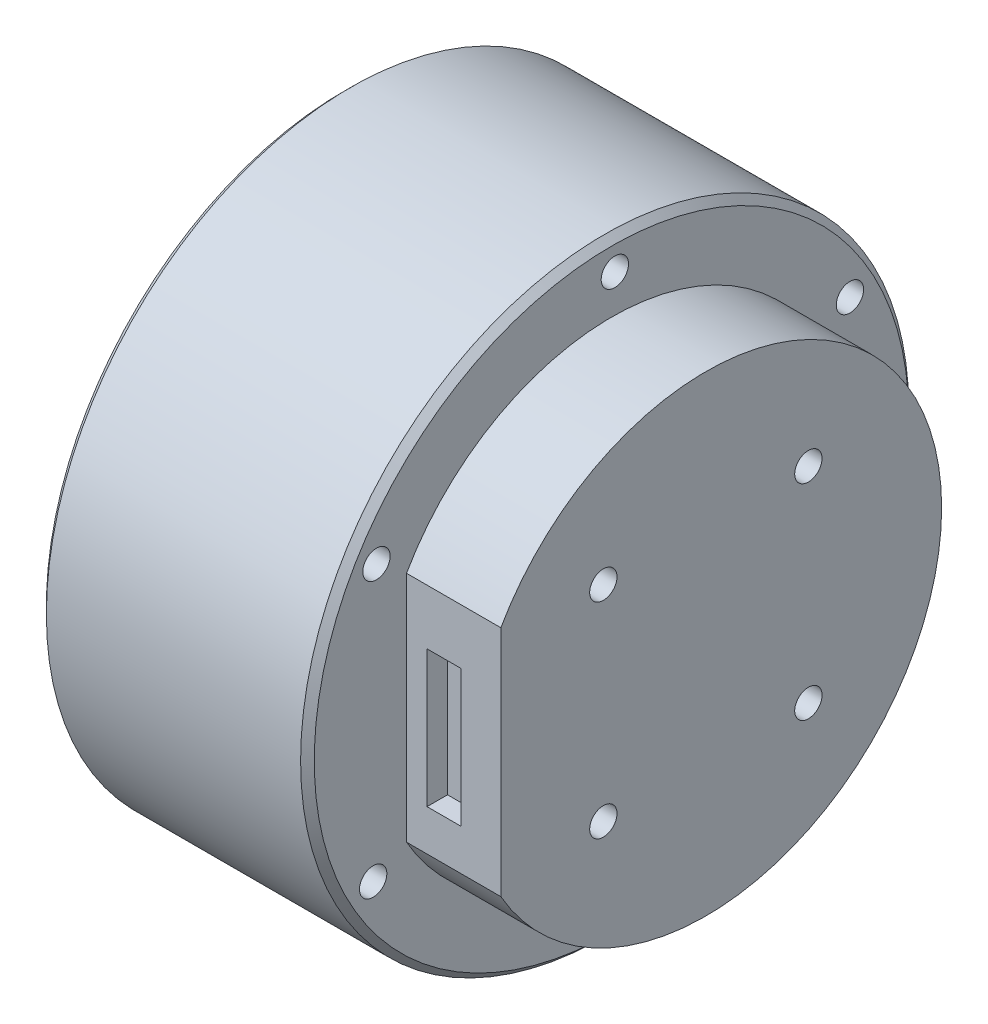
ISO-10303-21;
HEADER;
FILE_DESCRIPTION(('STEP AP214'),'2;1');
FILE_NAME('part.step','',(''),(''),'','','');
FILE_SCHEMA(('AUTOMOTIVE_DESIGN { 1 0 10303 214 1 1 1 1 }'));
ENDSEC;
DATA;
#1=APPLICATION_CONTEXT('core data for automotive mechanical design processes');
#2=APPLICATION_PROTOCOL_DEFINITION('international standard','automotive_design',2000,#1);
#3=PRODUCT_CONTEXT('',#1,'mechanical');
#4=PRODUCT('Part','Part','',(#3));
#5=PRODUCT_RELATED_PRODUCT_CATEGORY('part','',(#4));
#6=PRODUCT_DEFINITION_FORMATION('','',#4);
#7=PRODUCT_DEFINITION_CONTEXT('part definition',#1,'design');
#8=PRODUCT_DEFINITION('design','',#6,#7);
#9=PRODUCT_DEFINITION_SHAPE('','',#8);
#10=(LENGTH_UNIT() NAMED_UNIT(*) SI_UNIT(.MILLI.,.METRE.));
#11=(NAMED_UNIT(*) PLANE_ANGLE_UNIT() SI_UNIT($,.RADIAN.));
#12=(NAMED_UNIT(*) SI_UNIT($,.STERADIAN.) SOLID_ANGLE_UNIT());
#13=UNCERTAINTY_MEASURE_WITH_UNIT(LENGTH_MEASURE(1.E-05),#10,'distance_accuracy_value','');
#14=(GEOMETRIC_REPRESENTATION_CONTEXT(3) GLOBAL_UNCERTAINTY_ASSIGNED_CONTEXT((#13)) GLOBAL_UNIT_ASSIGNED_CONTEXT((#10,
#11,#12)) REPRESENTATION_CONTEXT('',''));
#15=CARTESIAN_POINT('',(0.,0.,0.));
#16=DIRECTION('',(0.,0.,1.));
#17=DIRECTION('',(1.,0.,0.));
#18=AXIS2_PLACEMENT_3D('',#15,#16,#17);
#19=CARTESIAN_POINT('',(39.2,0.,0.));
#20=DIRECTION('',(-1.,0.,0.));
#21=DIRECTION('',(0.,0.,1.));
#22=AXIS2_PLACEMENT_3D('',#19,#20,#21);
#23=CYLINDRICAL_SURFACE('',#22,44.5);
#24=CARTESIAN_POINT('',(38.2,0.,0.));
#25=DIRECTION('',(1.,0.,0.));
#26=DIRECTION('',(0.,0.,-1.));
#27=AXIS2_PLACEMENT_3D('',#24,#25,#26);
#28=CIRCLE('',#27,44.5);
#29=CARTESIAN_POINT('',(38.2,0.,-44.5));
#30=VERTEX_POINT('',#29);
#31=EDGE_CURVE('E45',#30,#30,#28,.F.);
#32=ORIENTED_EDGE('',*,*,#31,.T.);
#33=EDGE_LOOP('',(#32));
#34=FACE_BOUND('',#33,.T.);
#35=CARTESIAN_POINT('',(1.00000000000001,0.,0.));
#36=DIRECTION('',(1.,0.,0.));
#37=DIRECTION('',(0.,0.,-1.));
#38=AXIS2_PLACEMENT_3D('',#35,#36,#37);
#39=CIRCLE('',#38,44.5);
#40=CARTESIAN_POINT('',(1.00000000000001,0.,-44.5));
#41=VERTEX_POINT('',#40);
#42=EDGE_CURVE('E257',#41,#41,#39,.T.);
#43=ORIENTED_EDGE('',*,*,#42,.T.);
#44=EDGE_LOOP('',(#43));
#45=FACE_BOUND('',#44,.T.);
#46=ADVANCED_FACE('F36',(#34,#45),#23,.T.);
#47=CARTESIAN_POINT('',(39.2,0.,0.));
#48=DIRECTION('',(1.,0.,0.));
#49=DIRECTION('',(0.,0.,-1.));
#50=AXIS2_PLACEMENT_3D('',#47,#48,#49);
#51=PLANE('',#50);
#52=CARTESIAN_POINT('',(39.2,0.,0.));
#53=DIRECTION('',(1.,0.,0.));
#54=DIRECTION('',(0.,0.,-1.));
#55=AXIS2_PLACEMENT_3D('',#52,#53,#54);
#56=CIRCLE('',#55,43.5);
#57=CARTESIAN_POINT('',(39.2,0.,-43.5));
#58=VERTEX_POINT('',#57);
#59=EDGE_CURVE('E254',#58,#58,#56,.T.);
#60=ORIENTED_EDGE('',*,*,#59,.T.);
#61=EDGE_LOOP('',(#60));
#62=FACE_BOUND('',#61,.T.);
#63=CARTESIAN_POINT('',(39.2,39.997067774121,-0.484323726830935));
#64=DIRECTION('',(1.,0.,0.));
#65=DIRECTION('',(0.,0.,-1.));
#66=AXIS2_PLACEMENT_3D('',#63,#64,#65);
#67=CIRCLE('',#66,2.);
#68=CARTESIAN_POINT('',(39.2,39.997067774121,-2.48432372683093));
#69=VERTEX_POINT('',#68);
#70=EDGE_CURVE('E209',#69,#69,#67,.T.);
#71=ORIENTED_EDGE('',*,*,#70,.F.);
#72=EDGE_LOOP('',(#71));
#73=FACE_BOUND('',#72,.T.);
#74=CARTESIAN_POINT('',(39.2,20.4179705381501,34.3963149058604));
#75=DIRECTION('',(1.,0.,0.));
#76=DIRECTION('',(0.,0.,-1.));
#77=AXIS2_PLACEMENT_3D('',#74,#75,#76);
#78=CIRCLE('',#77,2.00000000000173);
#79=CARTESIAN_POINT('',(39.2,20.4179705381501,32.3963149058587));
#80=VERTEX_POINT('',#79);
#81=EDGE_CURVE('E202',#80,#80,#78,.T.);
#82=ORIENTED_EDGE('',*,*,#81,.F.);
#83=EDGE_LOOP('',(#82));
#84=FACE_BOUND('',#83,.T.);
#85=CARTESIAN_POINT('',(39.2,-19.5790972359709,34.8806386326897));
#86=DIRECTION('',(1.,0.,0.));
#87=DIRECTION('',(0.,0.,-1.));
#88=AXIS2_PLACEMENT_3D('',#85,#86,#87);
#89=CIRCLE('',#88,2.00000000000322);
#90=CARTESIAN_POINT('',(39.2,-19.5790972359709,32.8806386326864));
#91=VERTEX_POINT('',#90);
#92=EDGE_CURVE('E216',#91,#91,#89,.T.);
#93=ORIENTED_EDGE('',*,*,#92,.F.);
#94=EDGE_LOOP('',(#93));
#95=FACE_BOUND('',#94,.T.);
#96=CARTESIAN_POINT('',(39.2,-39.9970677741211,0.484323726827559));
#97=DIRECTION('',(1.,0.,0.));
#98=DIRECTION('',(0.,0.,-1.));
#99=AXIS2_PLACEMENT_3D('',#96,#97,#98);
#100=CIRCLE('',#99,2.00000000000348);
#101=CARTESIAN_POINT('',(39.2,-39.9970677741211,-1.51567627317592));
#102=VERTEX_POINT('',#101);
#103=EDGE_CURVE('E233',#102,#102,#100,.T.);
#104=ORIENTED_EDGE('',*,*,#103,.F.);
#105=EDGE_LOOP('',(#104));
#106=FACE_BOUND('',#105,.T.);
#107=CARTESIAN_POINT('',(39.2,-20.4179705381502,-34.3963149058638));
#108=DIRECTION('',(1.,0.,0.));
#109=DIRECTION('',(0.,0.,-1.));
#110=AXIS2_PLACEMENT_3D('',#107,#108,#109);
#111=CIRCLE('',#110,2.00000000000214);
#112=CARTESIAN_POINT('',(39.2,-20.4179705381502,-36.3963149058659));
#113=VERTEX_POINT('',#112);
#114=EDGE_CURVE('E227',#113,#113,#111,.T.);
#115=ORIENTED_EDGE('',*,*,#114,.F.);
#116=EDGE_LOOP('',(#115));
#117=FACE_BOUND('',#116,.T.);
#118=CARTESIAN_POINT('',(39.2,19.5790972359708,-34.880638632693));
#119=DIRECTION('',(1.,0.,0.));
#120=DIRECTION('',(0.,0.,-1.));
#121=AXIS2_PLACEMENT_3D('',#118,#119,#120);
#122=CIRCLE('',#121,2.00000000000045);
#123=CARTESIAN_POINT('',(39.2,19.5790972359708,-36.8806386326935));
#124=VERTEX_POINT('',#123);
#125=EDGE_CURVE('E221',#124,#124,#122,.T.);
#126=ORIENTED_EDGE('',*,*,#125,.F.);
#127=EDGE_LOOP('',(#126));
#128=FACE_BOUND('',#127,.T.);
#129=CARTESIAN_POINT('',(39.2,0.,0.));
#130=DIRECTION('',(1.,0.,0.));
#131=DIRECTION('',(0.,0.,-1.));
#132=AXIS2_PLACEMENT_3D('',#129,#130,#131);
#133=CIRCLE('',#132,34.5);
#134=CARTESIAN_POINT('',(39.2,-17.0367250374008,30.));
#135=VERTEX_POINT('',#134);
#136=CARTESIAN_POINT('',(39.2,17.0367250374008,30.));
#137=VERTEX_POINT('',#136);
#138=EDGE_CURVE('E208',#135,#137,#133,.T.);
#139=ORIENTED_EDGE('',*,*,#138,.F.);
#140=DIRECTION('',(0.,-1.,0.));
#141=VECTOR('',#140,1.);
#142=CARTESIAN_POINT('',(39.2,17.0367250374008,30.));
#143=LINE('',#142,#141);
#144=EDGE_CURVE('E59',#137,#135,#143,.T.);
#145=ORIENTED_EDGE('',*,*,#144,.F.);
#146=EDGE_LOOP('',(#139,#145));
#147=FACE_BOUND('',#146,.T.);
#148=ADVANCED_FACE('F270',(#62,#73,#84,#95,#106,#117,#128,#147),#51,.T.);
#149=CARTESIAN_POINT('',(0.,0.,0.));
#150=DIRECTION('',(1.,0.,0.));
#151=DIRECTION('',(0.,0.,-1.));
#152=AXIS2_PLACEMENT_3D('',#149,#150,#151);
#153=PLANE('',#152);
#154=CARTESIAN_POINT('',(0.,0.,0.));
#155=DIRECTION('',(-1.,0.,0.));
#156=DIRECTION('',(0.,0.,1.));
#157=AXIS2_PLACEMENT_3D('',#154,#155,#156);
#158=CIRCLE('',#157,8.75);
#159=CARTESIAN_POINT('',(0.,0.,8.75));
#160=VERTEX_POINT('',#159);
#161=EDGE_CURVE('E116',#160,#160,#158,.T.);
#162=ORIENTED_EDGE('',*,*,#161,.F.);
#163=EDGE_LOOP('',(#162));
#164=FACE_BOUND('',#163,.T.);
#165=CARTESIAN_POINT('',(0.,22.,0.));
#166=DIRECTION('',(-1.,0.,0.));
#167=DIRECTION('',(0.,0.,1.));
#168=AXIS2_PLACEMENT_3D('',#165,#166,#167);
#169=CIRCLE('',#168,2.5);
#170=CARTESIAN_POINT('',(0.,22.,2.5));
#171=VERTEX_POINT('',#170);
#172=EDGE_CURVE('E137',#171,#171,#169,.T.);
#173=ORIENTED_EDGE('',*,*,#172,.F.);
#174=EDGE_LOOP('',(#173));
#175=FACE_BOUND('',#174,.T.);
#176=CARTESIAN_POINT('',(0.,-12.3743686707639,12.3743686707665));
#177=DIRECTION('',(-1.,0.,0.));
#178=DIRECTION('',(0.,0.,1.));
#179=AXIS2_PLACEMENT_3D('',#176,#177,#178);
#180=CIRCLE('',#179,2.50000000000218);
#181=CARTESIAN_POINT('',(0.,-12.3743686707639,14.8743686707686));
#182=VERTEX_POINT('',#181);
#183=EDGE_CURVE('E151',#182,#182,#180,.T.);
#184=ORIENTED_EDGE('',*,*,#183,.F.);
#185=EDGE_LOOP('',(#184));
#186=FACE_BOUND('',#185,.T.);
#187=CARTESIAN_POINT('',(0.,-6.21602891884929E-13,-21.9999999999987));
#188=DIRECTION('',(-1.,0.,0.));
#189=DIRECTION('',(0.,0.,1.));
#190=AXIS2_PLACEMENT_3D('',#187,#188,#189);
#191=CIRCLE('',#190,2.5000000000012);
#192=CARTESIAN_POINT('',(0.,-6.21602891884929E-13,-19.4999999999975));
#193=VERTEX_POINT('',#192);
#194=EDGE_CURVE('E144',#193,#193,#191,.T.);
#195=ORIENTED_EDGE('',*,*,#194,.F.);
#196=EDGE_LOOP('',(#195));
#197=FACE_BOUND('',#196,.T.);
#198=CARTESIAN_POINT('',(0.,-12.3743686707651,-12.3743686707633));
#199=DIRECTION('',(-1.,0.,0.));
#200=DIRECTION('',(0.,0.,1.));
#201=AXIS2_PLACEMENT_3D('',#198,#199,#200);
#202=CIRCLE('',#201,2.50000000000114);
#203=CARTESIAN_POINT('',(0.,-12.3743686707651,-9.87436867076218));
#204=VERTEX_POINT('',#203);
#205=EDGE_CURVE('E129',#204,#204,#202,.T.);
#206=ORIENTED_EDGE('',*,*,#205,.F.);
#207=EDGE_LOOP('',(#206));
#208=FACE_BOUND('',#207,.T.);
#209=CARTESIAN_POINT('',(0.,12.3743686707646,-12.3743686707645));
#210=DIRECTION('',(-1.,0.,0.));
#211=DIRECTION('',(0.,0.,1.));
#212=AXIS2_PLACEMENT_3D('',#209,#210,#211);
#213=CIRCLE('',#212,2.5);
#214=CARTESIAN_POINT('',(0.,12.3743686707646,-9.87436867076452));
#215=VERTEX_POINT('',#214);
#216=EDGE_CURVE('E173',#215,#215,#213,.T.);
#217=ORIENTED_EDGE('',*,*,#216,.F.);
#218=EDGE_LOOP('',(#217));
#219=FACE_BOUND('',#218,.T.);
#220=CARTESIAN_POINT('',(0.,1.3301452940773E-12,22.0000000000006));
#221=DIRECTION('',(-1.,0.,0.));
#222=DIRECTION('',(0.,0.,1.));
#223=AXIS2_PLACEMENT_3D('',#220,#221,#222);
#224=CIRCLE('',#223,2.50000000000116);
#225=CARTESIAN_POINT('',(0.,1.3301452940773E-12,24.5000000000018));
#226=VERTEX_POINT('',#225);
#227=EDGE_CURVE('E162',#226,#226,#224,.T.);
#228=ORIENTED_EDGE('',*,*,#227,.F.);
#229=EDGE_LOOP('',(#228));
#230=FACE_BOUND('',#229,.T.);
#231=CARTESIAN_POINT('',(0.,12.3743686707658,12.3743686707653));
#232=DIRECTION('',(-1.,0.,0.));
#233=DIRECTION('',(0.,0.,1.));
#234=AXIS2_PLACEMENT_3D('',#231,#232,#233);
#235=CIRCLE('',#234,2.50000000000114);
#236=CARTESIAN_POINT('',(0.,12.3743686707658,14.8743686707664));
#237=VERTEX_POINT('',#236);
#238=EDGE_CURVE('E163',#237,#237,#235,.T.);
#239=ORIENTED_EDGE('',*,*,#238,.F.);
#240=EDGE_LOOP('',(#239));
#241=FACE_BOUND('',#240,.T.);
#242=CARTESIAN_POINT('',(0.,-21.9999999999993,1.9490539630041E-12));
#243=DIRECTION('',(-1.,0.,0.));
#244=DIRECTION('',(0.,0.,1.));
#245=AXIS2_PLACEMENT_3D('',#242,#243,#244);
#246=CIRCLE('',#245,2.50000000000222);
#247=CARTESIAN_POINT('',(0.,-21.9999999999993,2.50000000000417));
#248=VERTEX_POINT('',#247);
#249=EDGE_CURVE('E150',#248,#248,#246,.T.);
#250=ORIENTED_EDGE('',*,*,#249,.F.);
#251=EDGE_LOOP('',(#250));
#252=FACE_BOUND('',#251,.T.);
#253=CARTESIAN_POINT('',(0.,0.,0.));
#254=DIRECTION('',(1.,0.,0.));
#255=DIRECTION('',(0.,0.,-1.));
#256=AXIS2_PLACEMENT_3D('',#253,#254,#255);
#257=CIRCLE('',#256,43.5);
#258=CARTESIAN_POINT('',(0.,0.,-43.5));
#259=VERTEX_POINT('',#258);
#260=EDGE_CURVE('E11',#259,#259,#257,.F.);
#261=ORIENTED_EDGE('',*,*,#260,.T.);
#262=EDGE_LOOP('',(#261));
#263=FACE_BOUND('',#262,.T.);
#264=ADVANCED_FACE('F273',(#164,#175,#186,#197,#208,#219,#230,#241,#252,#263),#153,.F.);
#265=CARTESIAN_POINT('',(53.,0.,0.));
#266=DIRECTION('',(-1.,0.,0.));
#267=DIRECTION('',(0.,0.,1.));
#268=AXIS2_PLACEMENT_3D('',#265,#266,#267);
#269=CYLINDRICAL_SURFACE('',#268,34.5);
#270=ORIENTED_EDGE('',*,*,#138,.T.);
#271=DIRECTION('',(-1.,0.,0.));
#272=VECTOR('',#271,1.);
#273=CARTESIAN_POINT('',(53.,17.0367250374008,30.));
#274=LINE('',#273,#272);
#275=CARTESIAN_POINT('',(53.,17.0367250374008,30.));
#276=VERTEX_POINT('',#275);
#277=EDGE_CURVE('E252',#276,#137,#274,.T.);
#278=ORIENTED_EDGE('',*,*,#277,.F.);
#279=CARTESIAN_POINT('',(53.,0.,0.));
#280=DIRECTION('',(1.,0.,0.));
#281=DIRECTION('',(0.,0.,-1.));
#282=AXIS2_PLACEMENT_3D('',#279,#280,#281);
#283=CIRCLE('',#282,34.5);
#284=CARTESIAN_POINT('',(53.,-17.0367250374008,30.));
#285=VERTEX_POINT('',#284);
#286=EDGE_CURVE('E241',#285,#276,#283,.T.);
#287=ORIENTED_EDGE('',*,*,#286,.F.);
#288=DIRECTION('',(-1.,0.,0.));
#289=VECTOR('',#288,1.);
#290=CARTESIAN_POINT('',(53.,-17.0367250374008,30.));
#291=LINE('',#290,#289);
#292=EDGE_CURVE('E246',#285,#135,#291,.T.);
#293=ORIENTED_EDGE('',*,*,#292,.T.);
#294=EDGE_LOOP('',(#270,#278,#287,#293));
#295=FACE_BOUND('',#294,.T.);
#296=ADVANCED_FACE('F292',(#295),#269,.T.);
#297=CARTESIAN_POINT('',(53.,17.0367250374008,30.));
#298=DIRECTION('',(0.,0.,-1.));
#299=DIRECTION('',(-1.,0.,0.));
#300=AXIS2_PLACEMENT_3D('',#297,#298,#299);
#301=PLANE('',#300);
#302=DIRECTION('',(1.,0.,0.));
#303=VECTOR('',#302,1.);
#304=CARTESIAN_POINT('',(42.2,-11.0367250374008,30.));
#305=LINE('',#304,#303);
#306=CARTESIAN_POINT('',(42.2,-11.0367250374008,30.));
#307=VERTEX_POINT('',#306);
#308=CARTESIAN_POINT('',(47.2,-11.0367250374008,30.));
#309=VERTEX_POINT('',#308);
#310=EDGE_CURVE('E122',#307,#309,#305,.T.);
#311=ORIENTED_EDGE('',*,*,#310,.F.);
#312=DIRECTION('',(0.,-1.,0.));
#313=VECTOR('',#312,1.);
#314=CARTESIAN_POINT('',(42.2,8.96327496259916,30.));
#315=LINE('',#314,#313);
#316=CARTESIAN_POINT('',(42.2,8.96327496259916,30.));
#317=VERTEX_POINT('',#316);
#318=EDGE_CURVE('E52',#317,#307,#315,.T.);
#319=ORIENTED_EDGE('',*,*,#318,.F.);
#320=DIRECTION('',(-1.,0.,0.));
#321=VECTOR('',#320,1.);
#322=CARTESIAN_POINT('',(42.2,8.96327496259916,30.));
#323=LINE('',#322,#321);
#324=CARTESIAN_POINT('',(47.2,8.96327496259916,30.));
#325=VERTEX_POINT('',#324);
#326=EDGE_CURVE('E110',#325,#317,#323,.T.);
#327=ORIENTED_EDGE('',*,*,#326,.F.);
#328=DIRECTION('',(0.,1.,0.));
#329=VECTOR('',#328,1.);
#330=CARTESIAN_POINT('',(47.2,8.96327496259916,30.));
#331=LINE('',#330,#329);
#332=EDGE_CURVE('E113',#309,#325,#331,.T.);
#333=ORIENTED_EDGE('',*,*,#332,.F.);
#334=EDGE_LOOP('',(#311,#319,#327,#333));
#335=FACE_BOUND('',#334,.T.);
#336=ORIENTED_EDGE('',*,*,#144,.T.);
#337=ORIENTED_EDGE('',*,*,#292,.F.);
#338=DIRECTION('',(0.,-1.,0.));
#339=VECTOR('',#338,1.);
#340=CARTESIAN_POINT('',(53.,17.0367250374008,30.));
#341=LINE('',#340,#339);
#342=EDGE_CURVE('E244',#276,#285,#341,.T.);
#343=ORIENTED_EDGE('',*,*,#342,.F.);
#344=ORIENTED_EDGE('',*,*,#277,.T.);
#345=EDGE_LOOP('',(#336,#337,#343,#344));
#346=FACE_BOUND('',#345,.T.);
#347=ADVANCED_FACE('F290',(#335,#346),#301,.F.);
#348=CARTESIAN_POINT('',(53.,0.,0.));
#349=DIRECTION('',(1.,0.,0.));
#350=DIRECTION('',(0.,0.,-1.));
#351=AXIS2_PLACEMENT_3D('',#348,#349,#350);
#352=PLANE('',#351);
#353=CARTESIAN_POINT('',(53.,-15.,15.));
#354=DIRECTION('',(1.,0.,0.));
#355=DIRECTION('',(0.,0.,-1.));
#356=AXIS2_PLACEMENT_3D('',#353,#354,#355);
#357=CIRCLE('',#356,2.);
#358=CARTESIAN_POINT('',(53.,-15.,13.));
#359=VERTEX_POINT('',#358);
#360=EDGE_CURVE('E136',#359,#359,#357,.T.);
#361=ORIENTED_EDGE('',*,*,#360,.F.);
#362=EDGE_LOOP('',(#361));
#363=FACE_BOUND('',#362,.T.);
#364=CARTESIAN_POINT('',(53.,-15.,-15.));
#365=DIRECTION('',(1.,0.,0.));
#366=DIRECTION('',(0.,0.,-1.));
#367=AXIS2_PLACEMENT_3D('',#364,#365,#366);
#368=CIRCLE('',#367,2.);
#369=CARTESIAN_POINT('',(53.,-15.,-17.));
#370=VERTEX_POINT('',#369);
#371=EDGE_CURVE('E191',#370,#370,#368,.T.);
#372=ORIENTED_EDGE('',*,*,#371,.F.);
#373=EDGE_LOOP('',(#372));
#374=FACE_BOUND('',#373,.T.);
#375=CARTESIAN_POINT('',(53.,15.,-15.));
#376=DIRECTION('',(1.,0.,0.));
#377=DIRECTION('',(0.,0.,-1.));
#378=AXIS2_PLACEMENT_3D('',#375,#376,#377);
#379=CIRCLE('',#378,2.);
#380=CARTESIAN_POINT('',(53.,15.,-17.));
#381=VERTEX_POINT('',#380);
#382=EDGE_CURVE('E185',#381,#381,#379,.T.);
#383=ORIENTED_EDGE('',*,*,#382,.F.);
#384=EDGE_LOOP('',(#383));
#385=FACE_BOUND('',#384,.T.);
#386=CARTESIAN_POINT('',(53.,15.,15.));
#387=DIRECTION('',(1.,0.,0.));
#388=DIRECTION('',(0.,0.,-1.));
#389=AXIS2_PLACEMENT_3D('',#386,#387,#388);
#390=CIRCLE('',#389,2.);
#391=CARTESIAN_POINT('',(53.,15.,13.));
#392=VERTEX_POINT('',#391);
#393=EDGE_CURVE('E184',#392,#392,#390,.T.);
#394=ORIENTED_EDGE('',*,*,#393,.F.);
#395=EDGE_LOOP('',(#394));
#396=FACE_BOUND('',#395,.T.);
#397=ORIENTED_EDGE('',*,*,#286,.T.);
#398=ORIENTED_EDGE('',*,*,#342,.T.);
#399=EDGE_LOOP('',(#397,#398));
#400=FACE_BOUND('',#399,.T.);
#401=ADVANCED_FACE('F294',(#363,#374,#385,#396,#400),#352,.T.);
#402=CARTESIAN_POINT('',(25.4,19.5790972359708,-34.880638632693));
#403=DIRECTION('',(1.,0.,0.));
#404=DIRECTION('',(0.,0.,-1.));
#405=AXIS2_PLACEMENT_3D('',#402,#403,#404);
#406=CYLINDRICAL_SURFACE('',#405,2.00000000000045);
#407=CARTESIAN_POINT('',(25.4,19.5790972359708,-34.880638632693));
#408=DIRECTION('',(1.,0.,0.));
#409=DIRECTION('',(0.,0.,-1.));
#410=AXIS2_PLACEMENT_3D('',#407,#408,#409);
#411=CIRCLE('',#410,2.00000000000045);
#412=CARTESIAN_POINT('',(25.4,19.5790972359708,-36.8806386326935));
#413=VERTEX_POINT('',#412);
#414=EDGE_CURVE('E212',#413,#413,#411,.T.);
#415=ORIENTED_EDGE('',*,*,#414,.F.);
#416=EDGE_LOOP('',(#415));
#417=FACE_BOUND('',#416,.T.);
#418=ORIENTED_EDGE('',*,*,#125,.T.);
#419=EDGE_LOOP('',(#418));
#420=FACE_BOUND('',#419,.T.);
#421=ADVANCED_FACE('F296',(#417,#420),#406,.F.);
#422=CARTESIAN_POINT('',(25.4,19.5790972359708,-34.880638632693));
#423=DIRECTION('',(1.,0.,0.));
#424=DIRECTION('',(0.,0.,-1.));
#425=AXIS2_PLACEMENT_3D('',#422,#423,#424);
#426=PLANE('',#425);
#427=ORIENTED_EDGE('',*,*,#414,.T.);
#428=EDGE_LOOP('',(#427));
#429=FACE_BOUND('',#428,.T.);
#430=ADVANCED_FACE('F303',(#429),#426,.T.);
#431=CARTESIAN_POINT('',(25.4,-20.4179705381502,-34.3963149058638));
#432=DIRECTION('',(1.,0.,0.));
#433=DIRECTION('',(0.,0.,-1.));
#434=AXIS2_PLACEMENT_3D('',#431,#432,#433);
#435=CYLINDRICAL_SURFACE('',#434,2.00000000000214);
#436=CARTESIAN_POINT('',(25.4,-20.4179705381502,-34.3963149058638));
#437=DIRECTION('',(1.,0.,0.));
#438=DIRECTION('',(0.,0.,-1.));
#439=AXIS2_PLACEMENT_3D('',#436,#437,#438);
#440=CIRCLE('',#439,2.00000000000214);
#441=CARTESIAN_POINT('',(25.4,-20.4179705381502,-36.3963149058659));
#442=VERTEX_POINT('',#441);
#443=EDGE_CURVE('E224',#442,#442,#440,.T.);
#444=ORIENTED_EDGE('',*,*,#443,.F.);
#445=EDGE_LOOP('',(#444));
#446=FACE_BOUND('',#445,.T.);
#447=ORIENTED_EDGE('',*,*,#114,.T.);
#448=EDGE_LOOP('',(#447));
#449=FACE_BOUND('',#448,.T.);
#450=ADVANCED_FACE('F527',(#446,#449),#435,.F.);
#451=CARTESIAN_POINT('',(25.4,-20.4179705381502,-34.3963149058638));
#452=DIRECTION('',(1.,0.,0.));
#453=DIRECTION('',(0.,0.,-1.));
#454=AXIS2_PLACEMENT_3D('',#451,#452,#453);
#455=PLANE('',#454);
#456=ORIENTED_EDGE('',*,*,#443,.T.);
#457=EDGE_LOOP('',(#456));
#458=FACE_BOUND('',#457,.T.);
#459=ADVANCED_FACE('F530',(#458),#455,.T.);
#460=CARTESIAN_POINT('',(25.4,-39.9970677741211,0.484323726827559));
#461=DIRECTION('',(1.,0.,0.));
#462=DIRECTION('',(0.,0.,-1.));
#463=AXIS2_PLACEMENT_3D('',#460,#461,#462);
#464=CYLINDRICAL_SURFACE('',#463,2.00000000000348);
#465=CARTESIAN_POINT('',(25.4,-39.9970677741211,0.484323726827559));
#466=DIRECTION('',(1.,0.,0.));
#467=DIRECTION('',(0.,0.,-1.));
#468=AXIS2_PLACEMENT_3D('',#465,#466,#467);
#469=CIRCLE('',#468,2.00000000000348);
#470=CARTESIAN_POINT('',(25.4,-39.9970677741211,-1.51567627317592));
#471=VERTEX_POINT('',#470);
#472=EDGE_CURVE('E230',#471,#471,#469,.T.);
#473=ORIENTED_EDGE('',*,*,#472,.F.);
#474=EDGE_LOOP('',(#473));
#475=FACE_BOUND('',#474,.T.);
#476=ORIENTED_EDGE('',*,*,#103,.T.);
#477=EDGE_LOOP('',(#476));
#478=FACE_BOUND('',#477,.T.);
#479=ADVANCED_FACE('F533',(#475,#478),#464,.F.);
#480=CARTESIAN_POINT('',(25.4,-39.9970677741211,0.484323726827559));
#481=DIRECTION('',(1.,0.,0.));
#482=DIRECTION('',(0.,0.,-1.));
#483=AXIS2_PLACEMENT_3D('',#480,#481,#482);
#484=PLANE('',#483);
#485=ORIENTED_EDGE('',*,*,#472,.T.);
#486=EDGE_LOOP('',(#485));
#487=FACE_BOUND('',#486,.T.);
#488=ADVANCED_FACE('F538',(#487),#484,.T.);
#489=CARTESIAN_POINT('',(25.4,-19.5790972359709,34.8806386326897));
#490=DIRECTION('',(1.,0.,0.));
#491=DIRECTION('',(0.,0.,-1.));
#492=AXIS2_PLACEMENT_3D('',#489,#490,#491);
#493=CYLINDRICAL_SURFACE('',#492,2.00000000000322);
#494=CARTESIAN_POINT('',(25.4,-19.5790972359709,34.8806386326897));
#495=DIRECTION('',(1.,0.,0.));
#496=DIRECTION('',(0.,0.,-1.));
#497=AXIS2_PLACEMENT_3D('',#494,#495,#496);
#498=CIRCLE('',#497,2.00000000000322);
#499=CARTESIAN_POINT('',(25.4,-19.5790972359709,32.8806386326864));
#500=VERTEX_POINT('',#499);
#501=EDGE_CURVE('E236',#500,#500,#498,.T.);
#502=ORIENTED_EDGE('',*,*,#501,.F.);
#503=EDGE_LOOP('',(#502));
#504=FACE_BOUND('',#503,.T.);
#505=ORIENTED_EDGE('',*,*,#92,.T.);
#506=EDGE_LOOP('',(#505));
#507=FACE_BOUND('',#506,.T.);
#508=ADVANCED_FACE('F541',(#504,#507),#493,.F.);
#509=CARTESIAN_POINT('',(25.4,-19.5790972359709,34.8806386326897));
#510=DIRECTION('',(1.,0.,0.));
#511=DIRECTION('',(0.,0.,-1.));
#512=AXIS2_PLACEMENT_3D('',#509,#510,#511);
#513=PLANE('',#512);
#514=ORIENTED_EDGE('',*,*,#501,.T.);
#515=EDGE_LOOP('',(#514));
#516=FACE_BOUND('',#515,.T.);
#517=ADVANCED_FACE('F524',(#516),#513,.T.);
#518=CARTESIAN_POINT('',(25.4,20.4179705381501,34.3963149058604));
#519=DIRECTION('',(1.,0.,0.));
#520=DIRECTION('',(0.,0.,-1.));
#521=AXIS2_PLACEMENT_3D('',#518,#519,#520);
#522=CYLINDRICAL_SURFACE('',#521,2.00000000000173);
#523=CARTESIAN_POINT('',(25.4,20.4179705381501,34.3963149058604));
#524=DIRECTION('',(1.,0.,0.));
#525=DIRECTION('',(0.,0.,-1.));
#526=AXIS2_PLACEMENT_3D('',#523,#524,#525);
#527=CIRCLE('',#526,2.00000000000173);
#528=CARTESIAN_POINT('',(25.4,20.4179705381501,32.3963149058587));
#529=VERTEX_POINT('',#528);
#530=EDGE_CURVE('E213',#529,#529,#527,.T.);
#531=ORIENTED_EDGE('',*,*,#530,.F.);
#532=EDGE_LOOP('',(#531));
#533=FACE_BOUND('',#532,.T.);
#534=ORIENTED_EDGE('',*,*,#81,.T.);
#535=EDGE_LOOP('',(#534));
#536=FACE_BOUND('',#535,.T.);
#537=ADVANCED_FACE('F520',(#533,#536),#522,.F.);
#538=CARTESIAN_POINT('',(25.4,20.4179705381501,34.3963149058604));
#539=DIRECTION('',(1.,0.,0.));
#540=DIRECTION('',(0.,0.,-1.));
#541=AXIS2_PLACEMENT_3D('',#538,#539,#540);
#542=PLANE('',#541);
#543=ORIENTED_EDGE('',*,*,#530,.T.);
#544=EDGE_LOOP('',(#543));
#545=FACE_BOUND('',#544,.T.);
#546=ADVANCED_FACE('F516',(#545),#542,.T.);
#547=CARTESIAN_POINT('',(25.4,39.997067774121,-0.484323726830935));
#548=DIRECTION('',(1.,0.,0.));
#549=DIRECTION('',(0.,0.,-1.));
#550=AXIS2_PLACEMENT_3D('',#547,#548,#549);
#551=CYLINDRICAL_SURFACE('',#550,2.);
#552=CARTESIAN_POINT('',(25.4,39.997067774121,-0.484323726830935));
#553=DIRECTION('',(1.,0.,0.));
#554=DIRECTION('',(0.,0.,-1.));
#555=AXIS2_PLACEMENT_3D('',#552,#553,#554);
#556=CIRCLE('',#555,2.);
#557=CARTESIAN_POINT('',(25.4,39.997067774121,-2.48432372683093));
#558=VERTEX_POINT('',#557);
#559=EDGE_CURVE('E205',#558,#558,#556,.T.);
#560=ORIENTED_EDGE('',*,*,#559,.F.);
#561=EDGE_LOOP('',(#560));
#562=FACE_BOUND('',#561,.T.);
#563=ORIENTED_EDGE('',*,*,#70,.T.);
#564=EDGE_LOOP('',(#563));
#565=FACE_BOUND('',#564,.T.);
#566=ADVANCED_FACE('F512',(#562,#565),#551,.F.);
#567=CARTESIAN_POINT('',(25.4,39.997067774121,-0.484323726830935));
#568=DIRECTION('',(1.,0.,0.));
#569=DIRECTION('',(0.,0.,-1.));
#570=AXIS2_PLACEMENT_3D('',#567,#568,#569);
#571=PLANE('',#570);
#572=ORIENTED_EDGE('',*,*,#559,.T.);
#573=EDGE_LOOP('',(#572));
#574=FACE_BOUND('',#573,.T.);
#575=ADVANCED_FACE('F508',(#574),#571,.T.);
#576=CARTESIAN_POINT('',(43.,15.,15.));
#577=DIRECTION('',(1.,0.,0.));
#578=DIRECTION('',(0.,0.,-1.));
#579=AXIS2_PLACEMENT_3D('',#576,#577,#578);
#580=CYLINDRICAL_SURFACE('',#579,2.);
#581=CARTESIAN_POINT('',(43.,15.,15.));
#582=DIRECTION('',(1.,0.,0.));
#583=DIRECTION('',(0.,0.,-1.));
#584=AXIS2_PLACEMENT_3D('',#581,#582,#583);
#585=CIRCLE('',#584,2.);
#586=CARTESIAN_POINT('',(43.,15.,13.));
#587=VERTEX_POINT('',#586);
#588=EDGE_CURVE('E199',#587,#587,#585,.T.);
#589=ORIENTED_EDGE('',*,*,#588,.F.);
#590=EDGE_LOOP('',(#589));
#591=FACE_BOUND('',#590,.T.);
#592=ORIENTED_EDGE('',*,*,#393,.T.);
#593=EDGE_LOOP('',(#592));
#594=FACE_BOUND('',#593,.T.);
#595=ADVANCED_FACE('F504',(#591,#594),#580,.F.);
#596=CARTESIAN_POINT('',(43.,15.,15.));
#597=DIRECTION('',(1.,0.,0.));
#598=DIRECTION('',(0.,0.,-1.));
#599=AXIS2_PLACEMENT_3D('',#596,#597,#598);
#600=PLANE('',#599);
#601=ORIENTED_EDGE('',*,*,#588,.T.);
#602=EDGE_LOOP('',(#601));
#603=FACE_BOUND('',#602,.T.);
#604=ADVANCED_FACE('F486',(#603),#600,.T.);
#605=CARTESIAN_POINT('',(43.,15.,-15.));
#606=DIRECTION('',(1.,0.,0.));
#607=DIRECTION('',(0.,0.,-1.));
#608=AXIS2_PLACEMENT_3D('',#605,#606,#607);
#609=CYLINDRICAL_SURFACE('',#608,2.);
#610=CARTESIAN_POINT('',(43.,15.,-15.));
#611=DIRECTION('',(1.,0.,0.));
#612=DIRECTION('',(0.,0.,-1.));
#613=AXIS2_PLACEMENT_3D('',#610,#611,#612);
#614=CIRCLE('',#613,2.);
#615=CARTESIAN_POINT('',(43.,15.,-17.));
#616=VERTEX_POINT('',#615);
#617=EDGE_CURVE('E181',#616,#616,#614,.T.);
#618=ORIENTED_EDGE('',*,*,#617,.F.);
#619=EDGE_LOOP('',(#618));
#620=FACE_BOUND('',#619,.T.);
#621=ORIENTED_EDGE('',*,*,#382,.T.);
#622=EDGE_LOOP('',(#621));
#623=FACE_BOUND('',#622,.T.);
#624=ADVANCED_FACE('F482',(#620,#623),#609,.F.);
#625=CARTESIAN_POINT('',(43.,15.,-15.));
#626=DIRECTION('',(1.,0.,0.));
#627=DIRECTION('',(0.,0.,-1.));
#628=AXIS2_PLACEMENT_3D('',#625,#626,#627);
#629=PLANE('',#628);
#630=ORIENTED_EDGE('',*,*,#617,.T.);
#631=EDGE_LOOP('',(#630));
#632=FACE_BOUND('',#631,.T.);
#633=ADVANCED_FACE('F478',(#632),#629,.T.);
#634=CARTESIAN_POINT('',(43.,-15.,-15.));
#635=DIRECTION('',(1.,0.,0.));
#636=DIRECTION('',(0.,0.,-1.));
#637=AXIS2_PLACEMENT_3D('',#634,#635,#636);
#638=CYLINDRICAL_SURFACE('',#637,2.);
#639=CARTESIAN_POINT('',(43.,-15.,-15.));
#640=DIRECTION('',(1.,0.,0.));
#641=DIRECTION('',(0.,0.,-1.));
#642=AXIS2_PLACEMENT_3D('',#639,#640,#641);
#643=CIRCLE('',#642,2.);
#644=CARTESIAN_POINT('',(43.,-15.,-17.));
#645=VERTEX_POINT('',#644);
#646=EDGE_CURVE('E188',#645,#645,#643,.T.);
#647=ORIENTED_EDGE('',*,*,#646,.F.);
#648=EDGE_LOOP('',(#647));
#649=FACE_BOUND('',#648,.T.);
#650=ORIENTED_EDGE('',*,*,#371,.T.);
#651=EDGE_LOOP('',(#650));
#652=FACE_BOUND('',#651,.T.);
#653=ADVANCED_FACE('F481',(#649,#652),#638,.F.);
#654=CARTESIAN_POINT('',(43.,-15.,-15.));
#655=DIRECTION('',(1.,0.,0.));
#656=DIRECTION('',(0.,0.,-1.));
#657=AXIS2_PLACEMENT_3D('',#654,#655,#656);
#658=PLANE('',#657);
#659=ORIENTED_EDGE('',*,*,#646,.T.);
#660=EDGE_LOOP('',(#659));
#661=FACE_BOUND('',#660,.T.);
#662=ADVANCED_FACE('F488',(#661),#658,.T.);
#663=CARTESIAN_POINT('',(43.,-15.,15.));
#664=DIRECTION('',(1.,0.,0.));
#665=DIRECTION('',(0.,0.,-1.));
#666=AXIS2_PLACEMENT_3D('',#663,#664,#665);
#667=CYLINDRICAL_SURFACE('',#666,2.);
#668=CARTESIAN_POINT('',(43.,-15.,15.));
#669=DIRECTION('',(1.,0.,0.));
#670=DIRECTION('',(0.,0.,-1.));
#671=AXIS2_PLACEMENT_3D('',#668,#669,#670);
#672=CIRCLE('',#671,2.);
#673=CARTESIAN_POINT('',(43.,-15.,13.));
#674=VERTEX_POINT('',#673);
#675=EDGE_CURVE('E194',#674,#674,#672,.T.);
#676=ORIENTED_EDGE('',*,*,#675,.F.);
#677=EDGE_LOOP('',(#676));
#678=FACE_BOUND('',#677,.T.);
#679=ORIENTED_EDGE('',*,*,#360,.T.);
#680=EDGE_LOOP('',(#679));
#681=FACE_BOUND('',#680,.T.);
#682=ADVANCED_FACE('F491',(#678,#681),#667,.F.);
#683=CARTESIAN_POINT('',(43.,-15.,15.));
#684=DIRECTION('',(1.,0.,0.));
#685=DIRECTION('',(0.,0.,-1.));
#686=AXIS2_PLACEMENT_3D('',#683,#684,#685);
#687=PLANE('',#686);
#688=ORIENTED_EDGE('',*,*,#675,.T.);
#689=EDGE_LOOP('',(#688));
#690=FACE_BOUND('',#689,.T.);
#691=ADVANCED_FACE('F267',(#690),#687,.T.);
#692=CARTESIAN_POINT('',(39.2,0.,0.));
#693=DIRECTION('',(-1.,0.,0.));
#694=DIRECTION('',(0.,0.,1.));
#695=AXIS2_PLACEMENT_3D('',#692,#693,#694);
#696=CONICAL_SURFACE('',#695,43.5,0.785398163397448);
#697=ORIENTED_EDGE('',*,*,#31,.F.);
#698=EDGE_LOOP('',(#697));
#699=FACE_BOUND('',#698,.T.);
#700=ORIENTED_EDGE('',*,*,#59,.F.);
#701=EDGE_LOOP('',(#700));
#702=FACE_BOUND('',#701,.T.);
#703=ADVANCED_FACE('F264',(#699,#702),#696,.T.);
#704=CARTESIAN_POINT('',(1.00000000000001,0.,0.));
#705=DIRECTION('',(1.,0.,0.));
#706=DIRECTION('',(0.,0.,-1.));
#707=AXIS2_PLACEMENT_3D('',#704,#705,#706);
#708=CONICAL_SURFACE('',#707,44.5,0.785398163397448);
#709=ORIENTED_EDGE('',*,*,#260,.F.);
#710=EDGE_LOOP('',(#709));
#711=FACE_BOUND('',#710,.T.);
#712=ORIENTED_EDGE('',*,*,#42,.F.);
#713=EDGE_LOOP('',(#712));
#714=FACE_BOUND('',#713,.T.);
#715=ADVANCED_FACE('F39',(#711,#714),#708,.T.);
#716=CARTESIAN_POINT('',(5.,-21.9999999999993,1.9490539630041E-12));
#717=DIRECTION('',(-1.,0.,0.));
#718=DIRECTION('',(0.,0.,1.));
#719=AXIS2_PLACEMENT_3D('',#716,#717,#718);
#720=CYLINDRICAL_SURFACE('',#719,2.50000000000222);
#721=CARTESIAN_POINT('',(5.,-21.9999999999993,1.9490539630041E-12));
#722=DIRECTION('',(-1.,0.,0.));
#723=DIRECTION('',(0.,0.,1.));
#724=AXIS2_PLACEMENT_3D('',#721,#722,#723);
#725=CIRCLE('',#724,2.50000000000222);
#726=CARTESIAN_POINT('',(5.,-21.9999999999993,2.50000000000417));
#727=VERTEX_POINT('',#726);
#728=EDGE_CURVE('E166',#727,#727,#725,.T.);
#729=ORIENTED_EDGE('',*,*,#728,.F.);
#730=EDGE_LOOP('',(#729));
#731=FACE_BOUND('',#730,.T.);
#732=ORIENTED_EDGE('',*,*,#249,.T.);
#733=EDGE_LOOP('',(#732));
#734=FACE_BOUND('',#733,.T.);
#735=ADVANCED_FACE('F459',(#731,#734),#720,.F.);
#736=CARTESIAN_POINT('',(5.,-21.9999999999993,1.9490539630041E-12));
#737=DIRECTION('',(-1.,0.,0.));
#738=DIRECTION('',(0.,0.,1.));
#739=AXIS2_PLACEMENT_3D('',#736,#737,#738);
#740=PLANE('',#739);
#741=ORIENTED_EDGE('',*,*,#728,.T.);
#742=EDGE_LOOP('',(#741));
#743=FACE_BOUND('',#742,.T.);
#744=ADVANCED_FACE('F455',(#743),#740,.T.);
#745=CARTESIAN_POINT('',(5.,12.3743686707658,12.3743686707653));
#746=DIRECTION('',(-1.,0.,0.));
#747=DIRECTION('',(0.,0.,1.));
#748=AXIS2_PLACEMENT_3D('',#745,#746,#747);
#749=CYLINDRICAL_SURFACE('',#748,2.50000000000114);
#750=CARTESIAN_POINT('',(5.,12.3743686707658,12.3743686707653));
#751=DIRECTION('',(-1.,0.,0.));
#752=DIRECTION('',(0.,0.,1.));
#753=AXIS2_PLACEMENT_3D('',#750,#751,#752);
#754=CIRCLE('',#753,2.50000000000114);
#755=CARTESIAN_POINT('',(5.,12.3743686707658,14.8743686707664));
#756=VERTEX_POINT('',#755);
#757=EDGE_CURVE('E159',#756,#756,#754,.T.);
#758=ORIENTED_EDGE('',*,*,#757,.F.);
#759=EDGE_LOOP('',(#758));
#760=FACE_BOUND('',#759,.T.);
#761=ORIENTED_EDGE('',*,*,#238,.T.);
#762=EDGE_LOOP('',(#761));
#763=FACE_BOUND('',#762,.T.);
#764=ADVANCED_FACE('F451',(#760,#763),#749,.F.);
#765=CARTESIAN_POINT('',(5.,12.3743686707658,12.3743686707653));
#766=DIRECTION('',(-1.,0.,0.));
#767=DIRECTION('',(0.,0.,1.));
#768=AXIS2_PLACEMENT_3D('',#765,#766,#767);
#769=PLANE('',#768);
#770=ORIENTED_EDGE('',*,*,#757,.T.);
#771=EDGE_LOOP('',(#770));
#772=FACE_BOUND('',#771,.T.);
#773=ADVANCED_FACE('F447',(#772),#769,.T.);
#774=CARTESIAN_POINT('',(5.,1.3301452940773E-12,22.0000000000006));
#775=DIRECTION('',(-1.,0.,0.));
#776=DIRECTION('',(0.,0.,1.));
#777=AXIS2_PLACEMENT_3D('',#774,#775,#776);
#778=CYLINDRICAL_SURFACE('',#777,2.50000000000116);
#779=CARTESIAN_POINT('',(5.,1.3301452940773E-12,22.0000000000006));
#780=DIRECTION('',(-1.,0.,0.));
#781=DIRECTION('',(0.,0.,1.));
#782=AXIS2_PLACEMENT_3D('',#779,#780,#781);
#783=CIRCLE('',#782,2.50000000000116);
#784=CARTESIAN_POINT('',(5.,1.3301452940773E-12,24.5000000000018));
#785=VERTEX_POINT('',#784);
#786=EDGE_CURVE('E176',#785,#785,#783,.T.);
#787=ORIENTED_EDGE('',*,*,#786,.F.);
#788=EDGE_LOOP('',(#787));
#789=FACE_BOUND('',#788,.T.);
#790=ORIENTED_EDGE('',*,*,#227,.T.);
#791=EDGE_LOOP('',(#790));
#792=FACE_BOUND('',#791,.T.);
#793=ADVANCED_FACE('F450',(#789,#792),#778,.F.);
#794=CARTESIAN_POINT('',(5.,1.3301452940773E-12,22.0000000000006));
#795=DIRECTION('',(-1.,0.,0.));
#796=DIRECTION('',(0.,0.,1.));
#797=AXIS2_PLACEMENT_3D('',#794,#795,#796);
#798=PLANE('',#797);
#799=ORIENTED_EDGE('',*,*,#786,.T.);
#800=EDGE_LOOP('',(#799));
#801=FACE_BOUND('',#800,.T.);
#802=ADVANCED_FACE('F470',(#801),#798,.T.);
#803=CARTESIAN_POINT('',(5.,12.3743686707646,-12.3743686707645));
#804=DIRECTION('',(-1.,0.,0.));
#805=DIRECTION('',(0.,0.,1.));
#806=AXIS2_PLACEMENT_3D('',#803,#804,#805);
#807=CYLINDRICAL_SURFACE('',#806,2.5);
#808=CARTESIAN_POINT('',(5.,12.3743686707646,-12.3743686707645));
#809=DIRECTION('',(-1.,0.,0.));
#810=DIRECTION('',(0.,0.,1.));
#811=AXIS2_PLACEMENT_3D('',#808,#809,#810);
#812=CIRCLE('',#811,2.5);
#813=CARTESIAN_POINT('',(5.,12.3743686707646,-9.87436867076452));
#814=VERTEX_POINT('',#813);
#815=EDGE_CURVE('E140',#814,#814,#812,.T.);
#816=ORIENTED_EDGE('',*,*,#815,.F.);
#817=EDGE_LOOP('',(#816));
#818=FACE_BOUND('',#817,.T.);
#819=ORIENTED_EDGE('',*,*,#216,.T.);
#820=EDGE_LOOP('',(#819));
#821=FACE_BOUND('',#820,.T.);
#822=ADVANCED_FACE('F466',(#818,#821),#807,.F.);
#823=CARTESIAN_POINT('',(5.,12.3743686707646,-12.3743686707645));
#824=DIRECTION('',(-1.,0.,0.));
#825=DIRECTION('',(0.,0.,1.));
#826=AXIS2_PLACEMENT_3D('',#823,#824,#825);
#827=PLANE('',#826);
#828=ORIENTED_EDGE('',*,*,#815,.T.);
#829=EDGE_LOOP('',(#828));
#830=FACE_BOUND('',#829,.T.);
#831=ADVANCED_FACE('F431',(#830),#827,.T.);
#832=CARTESIAN_POINT('',(5.,-12.3743686707651,-12.3743686707633));
#833=DIRECTION('',(-1.,0.,0.));
#834=DIRECTION('',(0.,0.,1.));
#835=AXIS2_PLACEMENT_3D('',#832,#833,#834);
#836=CYLINDRICAL_SURFACE('',#835,2.50000000000114);
#837=CARTESIAN_POINT('',(5.,-12.3743686707651,-12.3743686707633));
#838=DIRECTION('',(-1.,0.,0.));
#839=DIRECTION('',(0.,0.,1.));
#840=AXIS2_PLACEMENT_3D('',#837,#838,#839);
#841=CIRCLE('',#840,2.50000000000114);
#842=CARTESIAN_POINT('',(5.,-12.3743686707651,-9.87436867076218));
#843=VERTEX_POINT('',#842);
#844=EDGE_CURVE('E141',#843,#843,#841,.T.);
#845=ORIENTED_EDGE('',*,*,#844,.F.);
#846=EDGE_LOOP('',(#845));
#847=FACE_BOUND('',#846,.T.);
#848=ORIENTED_EDGE('',*,*,#205,.T.);
#849=EDGE_LOOP('',(#848));
#850=FACE_BOUND('',#849,.T.);
#851=ADVANCED_FACE('F427',(#847,#850),#836,.F.);
#852=CARTESIAN_POINT('',(5.,-12.3743686707651,-12.3743686707633));
#853=DIRECTION('',(-1.,0.,0.));
#854=DIRECTION('',(0.,0.,1.));
#855=AXIS2_PLACEMENT_3D('',#852,#853,#854);
#856=PLANE('',#855);
#857=ORIENTED_EDGE('',*,*,#844,.T.);
#858=EDGE_LOOP('',(#857));
#859=FACE_BOUND('',#858,.T.);
#860=ADVANCED_FACE('F423',(#859),#856,.T.);
#861=CARTESIAN_POINT('',(5.,-6.21602891884929E-13,-21.9999999999987));
#862=DIRECTION('',(-1.,0.,0.));
#863=DIRECTION('',(0.,0.,1.));
#864=AXIS2_PLACEMENT_3D('',#861,#862,#863);
#865=CYLINDRICAL_SURFACE('',#864,2.5000000000012);
#866=CARTESIAN_POINT('',(5.,-6.21602891884929E-13,-21.9999999999987));
#867=DIRECTION('',(-1.,0.,0.));
#868=DIRECTION('',(0.,0.,1.));
#869=AXIS2_PLACEMENT_3D('',#866,#867,#868);
#870=CIRCLE('',#869,2.5000000000012);
#871=CARTESIAN_POINT('',(5.,-6.21602891884929E-13,-19.4999999999975));
#872=VERTEX_POINT('',#871);
#873=EDGE_CURVE('E154',#872,#872,#870,.T.);
#874=ORIENTED_EDGE('',*,*,#873,.F.);
#875=EDGE_LOOP('',(#874));
#876=FACE_BOUND('',#875,.T.);
#877=ORIENTED_EDGE('',*,*,#194,.T.);
#878=EDGE_LOOP('',(#877));
#879=FACE_BOUND('',#878,.T.);
#880=ADVANCED_FACE('F426',(#876,#879),#865,.F.);
#881=CARTESIAN_POINT('',(5.,-6.21602891884929E-13,-21.9999999999987));
#882=DIRECTION('',(-1.,0.,0.));
#883=DIRECTION('',(0.,0.,1.));
#884=AXIS2_PLACEMENT_3D('',#881,#882,#883);
#885=PLANE('',#884);
#886=ORIENTED_EDGE('',*,*,#873,.T.);
#887=EDGE_LOOP('',(#886));
#888=FACE_BOUND('',#887,.T.);
#889=ADVANCED_FACE('F439',(#888),#885,.T.);
#890=CARTESIAN_POINT('',(5.,-12.3743686707639,12.3743686707665));
#891=DIRECTION('',(-1.,0.,0.));
#892=DIRECTION('',(0.,0.,1.));
#893=AXIS2_PLACEMENT_3D('',#890,#891,#892);
#894=CYLINDRICAL_SURFACE('',#893,2.50000000000218);
#895=CARTESIAN_POINT('',(5.,-12.3743686707639,12.3743686707665));
#896=DIRECTION('',(-1.,0.,0.));
#897=DIRECTION('',(0.,0.,1.));
#898=AXIS2_PLACEMENT_3D('',#895,#896,#897);
#899=CIRCLE('',#898,2.50000000000218);
#900=CARTESIAN_POINT('',(5.,-12.3743686707639,14.8743686707686));
#901=VERTEX_POINT('',#900);
#902=EDGE_CURVE('E147',#901,#901,#899,.T.);
#903=ORIENTED_EDGE('',*,*,#902,.F.);
#904=EDGE_LOOP('',(#903));
#905=FACE_BOUND('',#904,.T.);
#906=ORIENTED_EDGE('',*,*,#183,.T.);
#907=EDGE_LOOP('',(#906));
#908=FACE_BOUND('',#907,.T.);
#909=ADVANCED_FACE('F435',(#905,#908),#894,.F.);
#910=CARTESIAN_POINT('',(5.,-12.3743686707639,12.3743686707665));
#911=DIRECTION('',(-1.,0.,0.));
#912=DIRECTION('',(0.,0.,1.));
#913=AXIS2_PLACEMENT_3D('',#910,#911,#912);
#914=PLANE('',#913);
#915=ORIENTED_EDGE('',*,*,#902,.T.);
#916=EDGE_LOOP('',(#915));
#917=FACE_BOUND('',#916,.T.);
#918=ADVANCED_FACE('F421',(#917),#914,.T.);
#919=CARTESIAN_POINT('',(5.,22.,0.));
#920=DIRECTION('',(-1.,0.,0.));
#921=DIRECTION('',(0.,0.,1.));
#922=AXIS2_PLACEMENT_3D('',#919,#920,#921);
#923=CYLINDRICAL_SURFACE('',#922,2.5);
#924=CARTESIAN_POINT('',(5.,22.,0.));
#925=DIRECTION('',(-1.,0.,0.));
#926=DIRECTION('',(0.,0.,1.));
#927=AXIS2_PLACEMENT_3D('',#924,#925,#926);
#928=CIRCLE('',#927,2.5);
#929=CARTESIAN_POINT('',(5.,22.,2.5));
#930=VERTEX_POINT('',#929);
#931=EDGE_CURVE('E133',#930,#930,#928,.T.);
#932=ORIENTED_EDGE('',*,*,#931,.F.);
#933=EDGE_LOOP('',(#932));
#934=FACE_BOUND('',#933,.T.);
#935=ORIENTED_EDGE('',*,*,#172,.T.);
#936=EDGE_LOOP('',(#935));
#937=FACE_BOUND('',#936,.T.);
#938=ADVANCED_FACE('F417',(#934,#937),#923,.F.);
#939=CARTESIAN_POINT('',(5.,22.,0.));
#940=DIRECTION('',(-1.,0.,0.));
#941=DIRECTION('',(0.,0.,1.));
#942=AXIS2_PLACEMENT_3D('',#939,#940,#941);
#943=PLANE('',#942);
#944=ORIENTED_EDGE('',*,*,#931,.T.);
#945=EDGE_LOOP('',(#944));
#946=FACE_BOUND('',#945,.T.);
#947=ADVANCED_FACE('F341',(#946),#943,.T.);
#948=CARTESIAN_POINT('',(42.2,8.96327496259916,27.));
#949=DIRECTION('',(-1.,0.,0.));
#950=DIRECTION('',(0.,0.,1.));
#951=AXIS2_PLACEMENT_3D('',#948,#949,#950);
#952=PLANE('',#951);
#953=ORIENTED_EDGE('',*,*,#318,.T.);
#954=DIRECTION('',(0.,0.,1.));
#955=VECTOR('',#954,1.);
#956=CARTESIAN_POINT('',(42.2,-11.0367250374008,27.));
#957=LINE('',#956,#955);
#958=CARTESIAN_POINT('',(42.2,-11.0367250374008,27.));
#959=VERTEX_POINT('',#958);
#960=EDGE_CURVE('E88',#959,#307,#957,.T.);
#961=ORIENTED_EDGE('',*,*,#960,.F.);
#962=DIRECTION('',(0.,-1.,0.));
#963=VECTOR('',#962,1.);
#964=CARTESIAN_POINT('',(42.2,8.96327496259916,27.));
#965=LINE('',#964,#963);
#966=CARTESIAN_POINT('',(42.2,8.96327496259916,27.));
#967=VERTEX_POINT('',#966);
#968=EDGE_CURVE('E92',#967,#959,#965,.T.);
#969=ORIENTED_EDGE('',*,*,#968,.F.);
#970=DIRECTION('',(0.,0.,1.));
#971=VECTOR('',#970,1.);
#972=CARTESIAN_POINT('',(42.2,8.96327496259916,27.));
#973=LINE('',#972,#971);
#974=EDGE_CURVE('E127',#967,#317,#973,.T.);
#975=ORIENTED_EDGE('',*,*,#974,.T.);
#976=EDGE_LOOP('',(#953,#961,#969,#975));
#977=FACE_BOUND('',#976,.T.);
#978=ADVANCED_FACE('F90',(#977),#952,.F.);
#979=CARTESIAN_POINT('',(42.2,8.96327496259916,27.));
#980=DIRECTION('',(0.,1.,0.));
#981=DIRECTION('',(-1.,0.,0.));
#982=AXIS2_PLACEMENT_3D('',#979,#980,#981);
#983=PLANE('',#982);
#984=ORIENTED_EDGE('',*,*,#326,.T.);
#985=ORIENTED_EDGE('',*,*,#974,.F.);
#986=DIRECTION('',(-1.,0.,0.));
#987=VECTOR('',#986,1.);
#988=CARTESIAN_POINT('',(42.2,8.96327496259916,27.));
#989=LINE('',#988,#987);
#990=CARTESIAN_POINT('',(47.2,8.96327496259916,27.));
#991=VERTEX_POINT('',#990);
#992=EDGE_CURVE('E98',#991,#967,#989,.T.);
#993=ORIENTED_EDGE('',*,*,#992,.F.);
#994=DIRECTION('',(0.,0.,1.));
#995=VECTOR('',#994,1.);
#996=CARTESIAN_POINT('',(47.2,8.96327496259916,27.));
#997=LINE('',#996,#995);
#998=EDGE_CURVE('E130',#991,#325,#997,.T.);
#999=ORIENTED_EDGE('',*,*,#998,.T.);
#1000=EDGE_LOOP('',(#984,#985,#993,#999));
#1001=FACE_BOUND('',#1000,.T.);
#1002=ADVANCED_FACE('F350',(#1001),#983,.F.);
#1003=CARTESIAN_POINT('',(47.2,8.96327496259916,27.));
#1004=DIRECTION('',(1.,0.,0.));
#1005=DIRECTION('',(0.,0.,-1.));
#1006=AXIS2_PLACEMENT_3D('',#1003,#1004,#1005);
#1007=PLANE('',#1006);
#1008=ORIENTED_EDGE('',*,*,#332,.T.);
#1009=ORIENTED_EDGE('',*,*,#998,.F.);
#1010=DIRECTION('',(0.,1.,0.));
#1011=VECTOR('',#1010,1.);
#1012=CARTESIAN_POINT('',(47.2,8.96327496259916,27.));
#1013=LINE('',#1012,#1011);
#1014=CARTESIAN_POINT('',(47.2,-11.0367250374008,27.));
#1015=VERTEX_POINT('',#1014);
#1016=EDGE_CURVE('E106',#1015,#991,#1013,.T.);
#1017=ORIENTED_EDGE('',*,*,#1016,.F.);
#1018=DIRECTION('',(0.,0.,1.));
#1019=VECTOR('',#1018,1.);
#1020=CARTESIAN_POINT('',(47.2,-11.0367250374008,27.));
#1021=LINE('',#1020,#1019);
#1022=EDGE_CURVE('E97',#1015,#309,#1021,.T.);
#1023=ORIENTED_EDGE('',*,*,#1022,.T.);
#1024=EDGE_LOOP('',(#1008,#1009,#1017,#1023));
#1025=FACE_BOUND('',#1024,.T.);
#1026=ADVANCED_FACE('F359',(#1025),#1007,.F.);
#1027=CARTESIAN_POINT('',(42.2,-11.0367250374008,27.));
#1028=DIRECTION('',(0.,-1.,0.));
#1029=DIRECTION('',(1.,0.,0.));
#1030=AXIS2_PLACEMENT_3D('',#1027,#1028,#1029);
#1031=PLANE('',#1030);
#1032=ORIENTED_EDGE('',*,*,#310,.T.);
#1033=ORIENTED_EDGE('',*,*,#1022,.F.);
#1034=DIRECTION('',(1.,0.,0.));
#1035=VECTOR('',#1034,1.);
#1036=CARTESIAN_POINT('',(42.2,-11.0367250374008,27.));
#1037=LINE('',#1036,#1035);
#1038=EDGE_CURVE('E101',#959,#1015,#1037,.T.);
#1039=ORIENTED_EDGE('',*,*,#1038,.F.);
#1040=ORIENTED_EDGE('',*,*,#960,.T.);
#1041=EDGE_LOOP('',(#1032,#1033,#1039,#1040));
#1042=FACE_BOUND('',#1041,.T.);
#1043=ADVANCED_FACE('F102',(#1042),#1031,.F.);
#1044=CARTESIAN_POINT('',(0.,0.,27.));
#1045=DIRECTION('',(0.,0.,1.));
#1046=DIRECTION('',(1.,0.,0.));
#1047=AXIS2_PLACEMENT_3D('',#1044,#1045,#1046);
#1048=PLANE('',#1047);
#1049=ORIENTED_EDGE('',*,*,#968,.T.);
#1050=ORIENTED_EDGE('',*,*,#1038,.T.);
#1051=ORIENTED_EDGE('',*,*,#1016,.T.);
#1052=ORIENTED_EDGE('',*,*,#992,.T.);
#1053=EDGE_LOOP('',(#1049,#1050,#1051,#1052));
#1054=FACE_BOUND('',#1053,.T.);
#1055=ADVANCED_FACE('F108',(#1054),#1048,.T.);
#1056=CARTESIAN_POINT('',(17.,0.,0.));
#1057=DIRECTION('',(-1.,0.,0.));
#1058=DIRECTION('',(0.,0.,1.));
#1059=AXIS2_PLACEMENT_3D('',#1056,#1057,#1058);
#1060=CYLINDRICAL_SURFACE('',#1059,8.75);
#1061=CARTESIAN_POINT('',(17.,0.,0.));
#1062=DIRECTION('',(-1.,0.,0.));
#1063=DIRECTION('',(0.,0.,1.));
#1064=AXIS2_PLACEMENT_3D('',#1061,#1062,#1063);
#1065=CIRCLE('',#1064,8.75);
#1066=CARTESIAN_POINT('',(17.,0.,8.75));
#1067=VERTEX_POINT('',#1066);
#1068=EDGE_CURVE('E123',#1067,#1067,#1065,.T.);
#1069=ORIENTED_EDGE('',*,*,#1068,.F.);
#1070=EDGE_LOOP('',(#1069));
#1071=FACE_BOUND('',#1070,.T.);
#1072=ORIENTED_EDGE('',*,*,#161,.T.);
#1073=EDGE_LOOP('',(#1072));
#1074=FACE_BOUND('',#1073,.T.);
#1075=ADVANCED_FACE('F385',(#1071,#1074),#1060,.F.);
#1076=CARTESIAN_POINT('',(17.,0.,0.));
#1077=DIRECTION('',(-1.,0.,0.));
#1078=DIRECTION('',(0.,0.,1.));
#1079=AXIS2_PLACEMENT_3D('',#1076,#1077,#1078);
#1080=PLANE('',#1079);
#1081=ORIENTED_EDGE('',*,*,#1068,.T.);
#1082=EDGE_LOOP('',(#1081));
#1083=FACE_BOUND('',#1082,.T.);
#1084=ADVANCED_FACE('F400',(#1083),#1080,.T.);
#1085=CLOSED_SHELL('',(#46,#148,#264,#296,#347,#401,#421,#430,#450,#459,#479,#488,#508,#517,
#537,#546,#566,#575,#595,#604,#624,#633,#653,#662,#682,#691,#703,#715,#735,#744,#764,#773,#793,
#802,#822,#831,#851,#860,#880,#889,#909,#918,#938,#947,#978,#1002,#1026,#1043,#1055,#1075,#1084));
#1086=MANIFOLD_SOLID_BREP('B2',#1085);
#1087=ADVANCED_BREP_SHAPE_REPRESENTATION('',(#18,#1086),#14);
#1088=SHAPE_DEFINITION_REPRESENTATION(#9,#1087);
ENDSEC;
END-ISO-10303-21;
